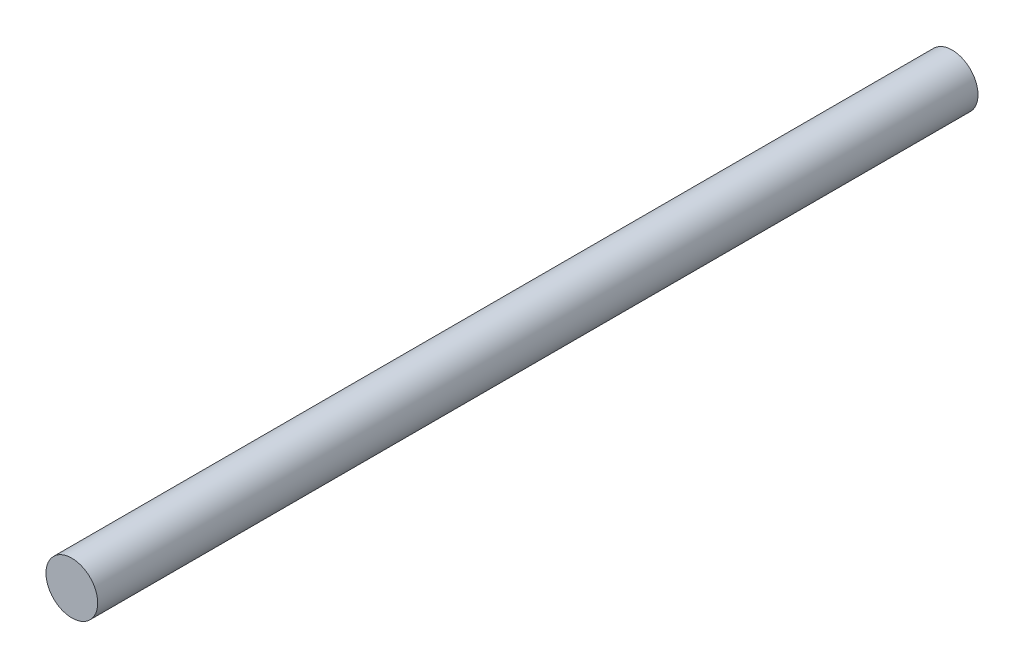
ISO-10303-21;
HEADER;
FILE_DESCRIPTION(('STEP AP214'),'2;1');
FILE_NAME('part.step','',(''),(''),'','','');
FILE_SCHEMA(('AUTOMOTIVE_DESIGN { 1 0 10303 214 1 1 1 1 }'));
ENDSEC;
DATA;
#1=APPLICATION_CONTEXT('core data for automotive mechanical design processes');
#2=APPLICATION_PROTOCOL_DEFINITION('international standard','automotive_design',2000,#1);
#3=PRODUCT_CONTEXT('',#1,'mechanical');
#4=PRODUCT('Part','Part','',(#3));
#5=PRODUCT_RELATED_PRODUCT_CATEGORY('part','',(#4));
#6=PRODUCT_DEFINITION_FORMATION('','',#4);
#7=PRODUCT_DEFINITION_CONTEXT('part definition',#1,'design');
#8=PRODUCT_DEFINITION('design','',#6,#7);
#9=PRODUCT_DEFINITION_SHAPE('','',#8);
#10=(LENGTH_UNIT() NAMED_UNIT(*) SI_UNIT(.MILLI.,.METRE.));
#11=(NAMED_UNIT(*) PLANE_ANGLE_UNIT() SI_UNIT($,.RADIAN.));
#12=(NAMED_UNIT(*) SI_UNIT($,.STERADIAN.) SOLID_ANGLE_UNIT());
#13=UNCERTAINTY_MEASURE_WITH_UNIT(LENGTH_MEASURE(1.E-05),#10,'distance_accuracy_value','');
#14=(GEOMETRIC_REPRESENTATION_CONTEXT(3) GLOBAL_UNCERTAINTY_ASSIGNED_CONTEXT((#13)) GLOBAL_UNIT_ASSIGNED_CONTEXT((#10,
#11,#12)) REPRESENTATION_CONTEXT('',''));
#15=CARTESIAN_POINT('',(0.,0.,0.));
#16=DIRECTION('',(0.,0.,1.));
#17=DIRECTION('',(1.,0.,0.));
#18=AXIS2_PLACEMENT_3D('',#15,#16,#17);
#19=CARTESIAN_POINT('',(0.,0.,42.5));
#20=DIRECTION('',(0.,0.,-1.));
#21=DIRECTION('',(-1.,0.,0.));
#22=AXIS2_PLACEMENT_3D('',#19,#20,#21);
#23=CYLINDRICAL_SURFACE('',#22,2.5);
#24=CARTESIAN_POINT('',(0.,0.,42.5));
#25=DIRECTION('',(0.,0.,1.));
#26=DIRECTION('',(1.,0.,0.));
#27=AXIS2_PLACEMENT_3D('',#24,#25,#26);
#28=CIRCLE('',#27,2.5);
#29=CARTESIAN_POINT('',(2.5,0.,42.5));
#30=VERTEX_POINT('',#29);
#31=EDGE_CURVE('E10',#30,#30,#28,.T.);
#32=ORIENTED_EDGE('',*,*,#31,.F.);
#33=EDGE_LOOP('',(#32));
#34=FACE_BOUND('',#33,.T.);
#35=CARTESIAN_POINT('',(0.,0.,-42.5));
#36=DIRECTION('',(0.,0.,1.));
#37=DIRECTION('',(1.,0.,0.));
#38=AXIS2_PLACEMENT_3D('',#35,#36,#37);
#39=CIRCLE('',#38,2.5);
#40=CARTESIAN_POINT('',(2.5,0.,-42.5));
#41=VERTEX_POINT('',#40);
#42=EDGE_CURVE('E40',#41,#41,#39,.T.);
#43=ORIENTED_EDGE('',*,*,#42,.T.);
#44=EDGE_LOOP('',(#43));
#45=FACE_BOUND('',#44,.T.);
#46=ADVANCED_FACE('F37',(#34,#45),#23,.T.);
#47=CARTESIAN_POINT('',(0.,0.,42.5));
#48=DIRECTION('',(0.,0.,1.));
#49=DIRECTION('',(1.,0.,0.));
#50=AXIS2_PLACEMENT_3D('',#47,#48,#49);
#51=PLANE('',#50);
#52=ORIENTED_EDGE('',*,*,#31,.T.);
#53=EDGE_LOOP('',(#52));
#54=FACE_BOUND('',#53,.T.);
#55=ADVANCED_FACE('F54',(#54),#51,.T.);
#56=CARTESIAN_POINT('',(0.,0.,-42.5));
#57=DIRECTION('',(0.,0.,1.));
#58=DIRECTION('',(1.,0.,0.));
#59=AXIS2_PLACEMENT_3D('',#56,#57,#58);
#60=PLANE('',#59);
#61=ORIENTED_EDGE('',*,*,#42,.F.);
#62=EDGE_LOOP('',(#61));
#63=FACE_BOUND('',#62,.T.);
#64=ADVANCED_FACE('F52',(#63),#60,.F.);
#65=CLOSED_SHELL('',(#46,#55,#64));
#66=MANIFOLD_SOLID_BREP('B2',#65);
#67=ADVANCED_BREP_SHAPE_REPRESENTATION('',(#18,#66),#14);
#68=SHAPE_DEFINITION_REPRESENTATION(#9,#67);
ENDSEC;
END-ISO-10303-21;
